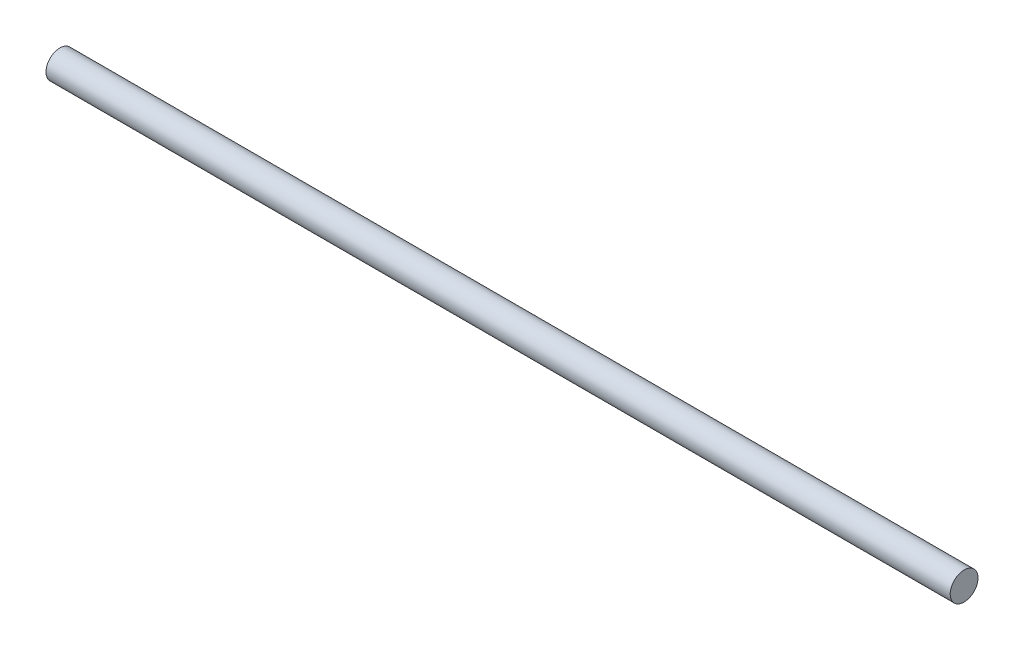
ISO-10303-21;
HEADER;
FILE_DESCRIPTION(('STEP AP214'),'2;1');
FILE_NAME('part.step','',(''),(''),'','','');
FILE_SCHEMA(('AUTOMOTIVE_DESIGN { 1 0 10303 214 1 1 1 1 }'));
ENDSEC;
DATA;
#1=APPLICATION_CONTEXT('core data for automotive mechanical design processes');
#2=APPLICATION_PROTOCOL_DEFINITION('international standard','automotive_design',2000,#1);
#3=PRODUCT_CONTEXT('',#1,'mechanical');
#4=PRODUCT('Part','Part','',(#3));
#5=PRODUCT_RELATED_PRODUCT_CATEGORY('part','',(#4));
#6=PRODUCT_DEFINITION_FORMATION('','',#4);
#7=PRODUCT_DEFINITION_CONTEXT('part definition',#1,'design');
#8=PRODUCT_DEFINITION('design','',#6,#7);
#9=PRODUCT_DEFINITION_SHAPE('','',#8);
#10=(LENGTH_UNIT() NAMED_UNIT(*) SI_UNIT(.MILLI.,.METRE.));
#11=(NAMED_UNIT(*) PLANE_ANGLE_UNIT() SI_UNIT($,.RADIAN.));
#12=(NAMED_UNIT(*) SI_UNIT($,.STERADIAN.) SOLID_ANGLE_UNIT());
#13=UNCERTAINTY_MEASURE_WITH_UNIT(LENGTH_MEASURE(1.E-05),#10,'distance_accuracy_value','');
#14=(GEOMETRIC_REPRESENTATION_CONTEXT(3) GLOBAL_UNCERTAINTY_ASSIGNED_CONTEXT((#13)) GLOBAL_UNIT_ASSIGNED_CONTEXT((#10,
#11,#12)) REPRESENTATION_CONTEXT('',''));
#15=CARTESIAN_POINT('',(0.,0.,0.));
#16=DIRECTION('',(0.,0.,1.));
#17=DIRECTION('',(1.,0.,0.));
#18=AXIS2_PLACEMENT_3D('',#15,#16,#17);
#19=CARTESIAN_POINT('',(0.,0.,0.));
#20=DIRECTION('',(-1.,0.,0.));
#21=DIRECTION('',(0.,-1.,0.));
#22=AXIS2_PLACEMENT_3D('',#19,#20,#21);
#23=PLANE('',#22);
#24=CARTESIAN_POINT('',(0.,0.,0.));
#25=DIRECTION('',(1.,0.,0.));
#26=DIRECTION('',(0.,1.,0.));
#27=AXIS2_PLACEMENT_3D('',#24,#25,#26);
#28=CIRCLE('',#27,2.);
#29=CARTESIAN_POINT('',(0.,2.,0.));
#30=VERTEX_POINT('',#29);
#31=EDGE_CURVE('E10',#30,#30,#28,.T.);
#32=ORIENTED_EDGE('',*,*,#31,.F.);
#33=EDGE_LOOP('',(#32));
#34=FACE_BOUND('',#33,.T.);
#35=ADVANCED_FACE('F32',(#34),#23,.T.);
#36=CARTESIAN_POINT('',(130.,0.,0.));
#37=DIRECTION('',(1.,0.,0.));
#38=DIRECTION('',(0.,1.,0.));
#39=AXIS2_PLACEMENT_3D('',#36,#37,#38);
#40=CYLINDRICAL_SURFACE('',#39,2.);
#41=ORIENTED_EDGE('',*,*,#31,.T.);
#42=EDGE_LOOP('',(#41));
#43=FACE_BOUND('',#42,.T.);
#44=CARTESIAN_POINT('',(130.,0.,0.));
#45=DIRECTION('',(1.,0.,0.));
#46=DIRECTION('',(0.,1.,0.));
#47=AXIS2_PLACEMENT_3D('',#44,#45,#46);
#48=CIRCLE('',#47,2.);
#49=CARTESIAN_POINT('',(130.,2.,0.));
#50=VERTEX_POINT('',#49);
#51=EDGE_CURVE('E38',#50,#50,#48,.T.);
#52=ORIENTED_EDGE('',*,*,#51,.F.);
#53=EDGE_LOOP('',(#52));
#54=FACE_BOUND('',#53,.T.);
#55=ADVANCED_FACE('F46',(#43,#54),#40,.T.);
#56=CARTESIAN_POINT('',(130.,2.,0.));
#57=DIRECTION('',(1.,0.,0.));
#58=DIRECTION('',(0.,1.,0.));
#59=AXIS2_PLACEMENT_3D('',#56,#57,#58);
#60=PLANE('',#59);
#61=ORIENTED_EDGE('',*,*,#51,.T.);
#62=EDGE_LOOP('',(#61));
#63=FACE_BOUND('',#62,.T.);
#64=ADVANCED_FACE('F44',(#63),#60,.T.);
#65=CLOSED_SHELL('',(#35,#55,#64));
#66=MANIFOLD_SOLID_BREP('B2',#65);
#67=ADVANCED_BREP_SHAPE_REPRESENTATION('',(#18,#66),#14);
#68=SHAPE_DEFINITION_REPRESENTATION(#9,#67);
ENDSEC;
END-ISO-10303-21;
